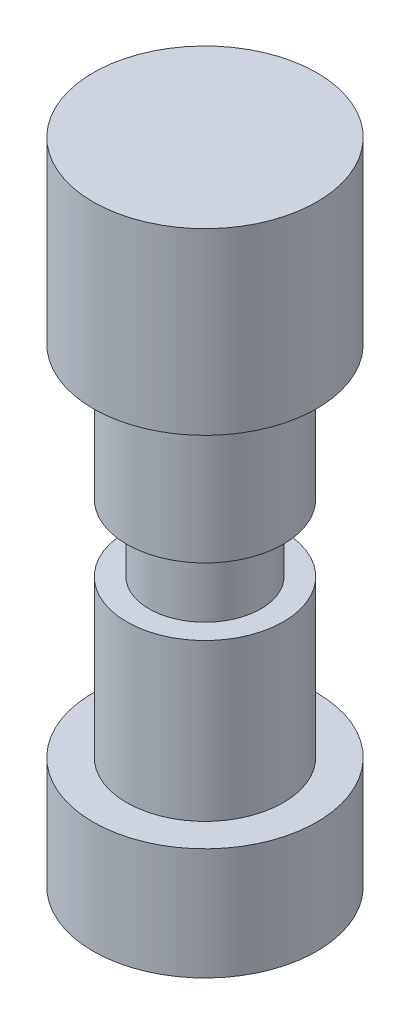
ISO-10303-21;
HEADER;
FILE_DESCRIPTION(('STEP AP214'),'2;1');
FILE_NAME('part.step','',(''),(''),'','','');
FILE_SCHEMA(('AUTOMOTIVE_DESIGN { 1 0 10303 214 1 1 1 1 }'));
ENDSEC;
DATA;
#1=APPLICATION_CONTEXT('core data for automotive mechanical design processes');
#2=APPLICATION_PROTOCOL_DEFINITION('international standard','automotive_design',2000,#1);
#3=PRODUCT_CONTEXT('',#1,'mechanical');
#4=PRODUCT('Part','Part','',(#3));
#5=PRODUCT_RELATED_PRODUCT_CATEGORY('part','',(#4));
#6=PRODUCT_DEFINITION_FORMATION('','',#4);
#7=PRODUCT_DEFINITION_CONTEXT('part definition',#1,'design');
#8=PRODUCT_DEFINITION('design','',#6,#7);
#9=PRODUCT_DEFINITION_SHAPE('','',#8);
#10=(LENGTH_UNIT() NAMED_UNIT(*) SI_UNIT(.MILLI.,.METRE.));
#11=(NAMED_UNIT(*) PLANE_ANGLE_UNIT() SI_UNIT($,.RADIAN.));
#12=(NAMED_UNIT(*) SI_UNIT($,.STERADIAN.) SOLID_ANGLE_UNIT());
#13=UNCERTAINTY_MEASURE_WITH_UNIT(LENGTH_MEASURE(1.E-05),#10,'distance_accuracy_value','');
#14=(GEOMETRIC_REPRESENTATION_CONTEXT(3) GLOBAL_UNCERTAINTY_ASSIGNED_CONTEXT((#13)) GLOBAL_UNIT_ASSIGNED_CONTEXT((#10,
#11,#12)) REPRESENTATION_CONTEXT('',''));
#15=CARTESIAN_POINT('',(0.,0.,0.));
#16=DIRECTION('',(0.,0.,1.));
#17=DIRECTION('',(1.,0.,0.));
#18=AXIS2_PLACEMENT_3D('',#15,#16,#17);
#19=CARTESIAN_POINT('',(0.,0.,0.));
#20=DIRECTION('',(0.,1.,0.));
#21=DIRECTION('',(0.,0.,1.));
#22=AXIS2_PLACEMENT_3D('',#19,#20,#21);
#23=PLANE('',#22);
#24=CARTESIAN_POINT('',(0.,0.,0.));
#25=DIRECTION('',(0.,-1.,0.));
#26=DIRECTION('',(0.,0.,-1.));
#27=AXIS2_PLACEMENT_3D('',#24,#25,#26);
#28=CIRCLE('',#27,25.);
#29=CARTESIAN_POINT('',(0.,0.,-25.));
#30=VERTEX_POINT('',#29);
#31=EDGE_CURVE('E10',#30,#30,#28,.T.);
#32=ORIENTED_EDGE('',*,*,#31,.F.);
#33=EDGE_LOOP('',(#32));
#34=FACE_BOUND('',#33,.T.);
#35=ADVANCED_FACE('F31',(#34),#23,.T.);
#36=CARTESIAN_POINT('',(0.,1.11158200514519E-11,0.));
#37=DIRECTION('',(0.,-1.,0.));
#38=DIRECTION('',(0.,0.,-1.));
#39=AXIS2_PLACEMENT_3D('',#36,#37,#38);
#40=CYLINDRICAL_SURFACE('',#39,25.);
#41=ORIENTED_EDGE('',*,*,#31,.T.);
#42=EDGE_LOOP('',(#41));
#43=FACE_BOUND('',#42,.T.);
#44=CARTESIAN_POINT('',(0.,-40.,0.));
#45=DIRECTION('',(0.,-1.,0.));
#46=DIRECTION('',(0.,0.,-1.));
#47=AXIS2_PLACEMENT_3D('',#44,#45,#46);
#48=CIRCLE('',#47,25.);
#49=CARTESIAN_POINT('',(0.,-40.,-25.));
#50=VERTEX_POINT('',#49);
#51=EDGE_CURVE('E37',#50,#50,#48,.T.);
#52=ORIENTED_EDGE('',*,*,#51,.F.);
#53=EDGE_LOOP('',(#52));
#54=FACE_BOUND('',#53,.T.);
#55=ADVANCED_FACE('F85',(#43,#54),#40,.T.);
#56=CARTESIAN_POINT('',(25.,-40.,0.));
#57=DIRECTION('',(0.,-1.,0.));
#58=DIRECTION('',(0.,0.,-1.));
#59=AXIS2_PLACEMENT_3D('',#56,#57,#58);
#60=PLANE('',#59);
#61=ORIENTED_EDGE('',*,*,#51,.T.);
#62=EDGE_LOOP('',(#61));
#63=FACE_BOUND('',#62,.T.);
#64=CARTESIAN_POINT('',(0.,-40.,0.));
#65=DIRECTION('',(0.,-1.,0.));
#66=DIRECTION('',(0.,0.,-1.));
#67=AXIS2_PLACEMENT_3D('',#64,#65,#66);
#68=CIRCLE('',#67,17.5);
#69=CARTESIAN_POINT('',(0.,-40.,-17.5));
#70=VERTEX_POINT('',#69);
#71=EDGE_CURVE('E41',#70,#70,#68,.T.);
#72=ORIENTED_EDGE('',*,*,#71,.F.);
#73=EDGE_LOOP('',(#72));
#74=FACE_BOUND('',#73,.T.);
#75=ADVANCED_FACE('F90',(#63,#74),#60,.T.);
#76=CARTESIAN_POINT('',(0.,1.11158200514519E-11,0.));
#77=DIRECTION('',(0.,-1.,0.));
#78=DIRECTION('',(0.,0.,-1.));
#79=AXIS2_PLACEMENT_3D('',#76,#77,#78);
#80=CYLINDRICAL_SURFACE('',#79,17.5);
#81=ORIENTED_EDGE('',*,*,#71,.T.);
#82=EDGE_LOOP('',(#81));
#83=FACE_BOUND('',#82,.T.);
#84=CARTESIAN_POINT('',(0.,-70.,0.));
#85=DIRECTION('',(0.,-1.,0.));
#86=DIRECTION('',(0.,0.,-1.));
#87=AXIS2_PLACEMENT_3D('',#84,#85,#86);
#88=CIRCLE('',#87,17.5);
#89=CARTESIAN_POINT('',(0.,-70.,-17.5));
#90=VERTEX_POINT('',#89);
#91=EDGE_CURVE('E45',#90,#90,#88,.T.);
#92=ORIENTED_EDGE('',*,*,#91,.F.);
#93=EDGE_LOOP('',(#92));
#94=FACE_BOUND('',#93,.T.);
#95=ADVANCED_FACE('F94',(#83,#94),#80,.T.);
#96=CARTESIAN_POINT('',(17.5,-70.,0.));
#97=DIRECTION('',(0.,-1.,0.));
#98=DIRECTION('',(0.,0.,-1.));
#99=AXIS2_PLACEMENT_3D('',#96,#97,#98);
#100=PLANE('',#99);
#101=ORIENTED_EDGE('',*,*,#91,.T.);
#102=EDGE_LOOP('',(#101));
#103=FACE_BOUND('',#102,.T.);
#104=CARTESIAN_POINT('',(0.,-70.,0.));
#105=DIRECTION('',(0.,-1.,0.));
#106=DIRECTION('',(0.,0.,-1.));
#107=AXIS2_PLACEMENT_3D('',#104,#105,#106);
#108=CIRCLE('',#107,12.5);
#109=CARTESIAN_POINT('',(0.,-70.,-12.5));
#110=VERTEX_POINT('',#109);
#111=EDGE_CURVE('E50',#110,#110,#108,.T.);
#112=ORIENTED_EDGE('',*,*,#111,.F.);
#113=EDGE_LOOP('',(#112));
#114=FACE_BOUND('',#113,.T.);
#115=ADVANCED_FACE('F100',(#103,#114),#100,.T.);
#116=CARTESIAN_POINT('',(0.,1.11158200514519E-11,0.));
#117=DIRECTION('',(0.,-1.,0.));
#118=DIRECTION('',(0.,0.,-1.));
#119=AXIS2_PLACEMENT_3D('',#116,#117,#118);
#120=CYLINDRICAL_SURFACE('',#119,12.5);
#121=ORIENTED_EDGE('',*,*,#111,.T.);
#122=EDGE_LOOP('',(#121));
#123=FACE_BOUND('',#122,.T.);
#124=CARTESIAN_POINT('',(0.,-85.,0.));
#125=DIRECTION('',(0.,-1.,0.));
#126=DIRECTION('',(0.,0.,-1.));
#127=AXIS2_PLACEMENT_3D('',#124,#125,#126);
#128=CIRCLE('',#127,12.5);
#129=CARTESIAN_POINT('',(0.,-85.,-12.5));
#130=VERTEX_POINT('',#129);
#131=EDGE_CURVE('E53',#130,#130,#128,.T.);
#132=ORIENTED_EDGE('',*,*,#131,.F.);
#133=EDGE_LOOP('',(#132));
#134=FACE_BOUND('',#133,.T.);
#135=ADVANCED_FACE('F104',(#123,#134),#120,.T.);
#136=CARTESIAN_POINT('',(12.5,-85.,0.));
#137=DIRECTION('',(0.,1.,0.));
#138=DIRECTION('',(0.,0.,1.));
#139=AXIS2_PLACEMENT_3D('',#136,#137,#138);
#140=PLANE('',#139);
#141=ORIENTED_EDGE('',*,*,#131,.T.);
#142=EDGE_LOOP('',(#141));
#143=FACE_BOUND('',#142,.T.);
#144=CARTESIAN_POINT('',(0.,-85.,0.));
#145=DIRECTION('',(0.,-1.,0.));
#146=DIRECTION('',(0.,0.,-1.));
#147=AXIS2_PLACEMENT_3D('',#144,#145,#146);
#148=CIRCLE('',#147,17.5);
#149=CARTESIAN_POINT('',(0.,-85.,-17.5));
#150=VERTEX_POINT('',#149);
#151=EDGE_CURVE('E56',#150,#150,#148,.T.);
#152=ORIENTED_EDGE('',*,*,#151,.F.);
#153=EDGE_LOOP('',(#152));
#154=FACE_BOUND('',#153,.T.);
#155=ADVANCED_FACE('F108',(#143,#154),#140,.T.);
#156=CARTESIAN_POINT('',(0.,1.11158200514519E-11,0.));
#157=DIRECTION('',(0.,-1.,0.));
#158=DIRECTION('',(0.,0.,-1.));
#159=AXIS2_PLACEMENT_3D('',#156,#157,#158);
#160=CYLINDRICAL_SURFACE('',#159,17.5);
#161=ORIENTED_EDGE('',*,*,#151,.T.);
#162=EDGE_LOOP('',(#161));
#163=FACE_BOUND('',#162,.T.);
#164=CARTESIAN_POINT('',(0.,-120.,0.));
#165=DIRECTION('',(0.,-1.,0.));
#166=DIRECTION('',(0.,0.,-1.));
#167=AXIS2_PLACEMENT_3D('',#164,#165,#166);
#168=CIRCLE('',#167,17.5);
#169=CARTESIAN_POINT('',(0.,-120.,-17.5));
#170=VERTEX_POINT('',#169);
#171=EDGE_CURVE('E59',#170,#170,#168,.T.);
#172=ORIENTED_EDGE('',*,*,#171,.F.);
#173=EDGE_LOOP('',(#172));
#174=FACE_BOUND('',#173,.T.);
#175=ADVANCED_FACE('F81',(#163,#174),#160,.T.);
#176=CARTESIAN_POINT('',(17.5,-120.,0.));
#177=DIRECTION('',(0.,1.,0.));
#178=DIRECTION('',(0.,0.,1.));
#179=AXIS2_PLACEMENT_3D('',#176,#177,#178);
#180=PLANE('',#179);
#181=ORIENTED_EDGE('',*,*,#171,.T.);
#182=EDGE_LOOP('',(#181));
#183=FACE_BOUND('',#182,.T.);
#184=CARTESIAN_POINT('',(0.,-120.,0.));
#185=DIRECTION('',(0.,-1.,0.));
#186=DIRECTION('',(0.,0.,-1.));
#187=AXIS2_PLACEMENT_3D('',#184,#185,#186);
#188=CIRCLE('',#187,25.);
#189=CARTESIAN_POINT('',(0.,-120.,-25.));
#190=VERTEX_POINT('',#189);
#191=EDGE_CURVE('E62',#190,#190,#188,.T.);
#192=ORIENTED_EDGE('',*,*,#191,.F.);
#193=EDGE_LOOP('',(#192));
#194=FACE_BOUND('',#193,.T.);
#195=ADVANCED_FACE('F73',(#183,#194),#180,.T.);
#196=CARTESIAN_POINT('',(0.,1.11158200514519E-11,0.));
#197=DIRECTION('',(0.,-1.,0.));
#198=DIRECTION('',(0.,0.,-1.));
#199=AXIS2_PLACEMENT_3D('',#196,#197,#198);
#200=CYLINDRICAL_SURFACE('',#199,25.);
#201=ORIENTED_EDGE('',*,*,#191,.T.);
#202=EDGE_LOOP('',(#201));
#203=FACE_BOUND('',#202,.T.);
#204=CARTESIAN_POINT('',(0.,-145.,0.));
#205=DIRECTION('',(0.,-1.,0.));
#206=DIRECTION('',(0.,0.,-1.));
#207=AXIS2_PLACEMENT_3D('',#204,#205,#206);
#208=CIRCLE('',#207,25.);
#209=CARTESIAN_POINT('',(0.,-145.,-25.));
#210=VERTEX_POINT('',#209);
#211=EDGE_CURVE('E65',#210,#210,#208,.T.);
#212=ORIENTED_EDGE('',*,*,#211,.F.);
#213=EDGE_LOOP('',(#212));
#214=FACE_BOUND('',#213,.T.);
#215=ADVANCED_FACE('F71',(#203,#214),#200,.T.);
#216=CARTESIAN_POINT('',(25.,-145.,0.));
#217=DIRECTION('',(0.,-1.,0.));
#218=DIRECTION('',(0.,0.,-1.));
#219=AXIS2_PLACEMENT_3D('',#216,#217,#218);
#220=PLANE('',#219);
#221=ORIENTED_EDGE('',*,*,#211,.T.);
#222=EDGE_LOOP('',(#221));
#223=FACE_BOUND('',#222,.T.);
#224=ADVANCED_FACE('F69',(#223),#220,.T.);
#225=CLOSED_SHELL('',(#35,#55,#75,#95,#115,#135,#155,#175,#195,#215,#224));
#226=MANIFOLD_SOLID_BREP('B2',#225);
#227=ADVANCED_BREP_SHAPE_REPRESENTATION('',(#18,#226),#14);
#228=SHAPE_DEFINITION_REPRESENTATION(#9,#227);
ENDSEC;
END-ISO-10303-21;
